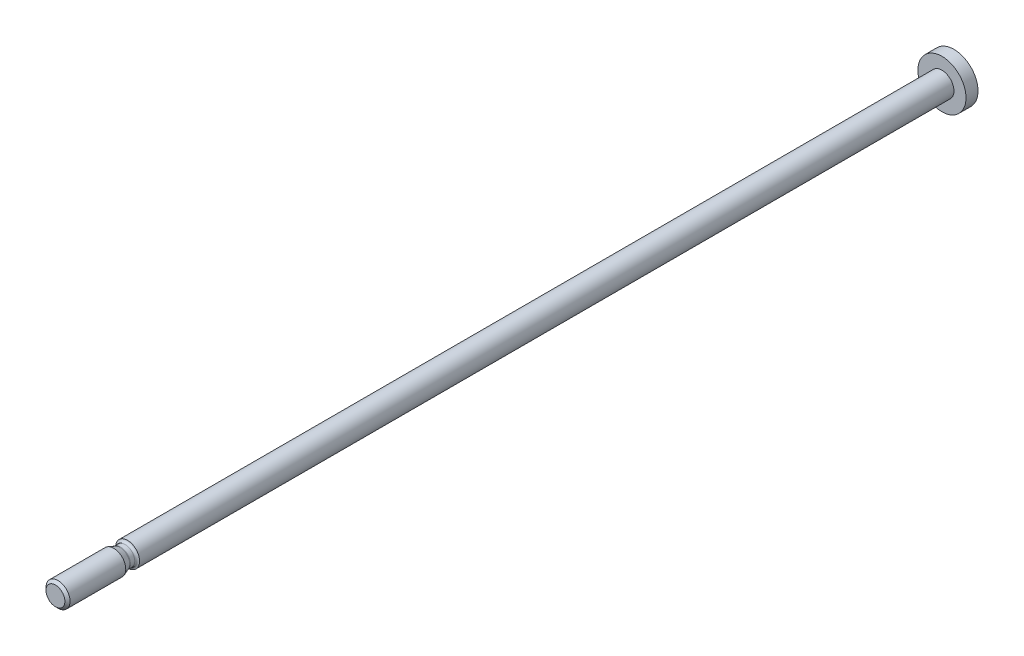
ISO-10303-21;
HEADER;
FILE_DESCRIPTION(('STEP AP214'),'2;1');
FILE_NAME('part.step','',(''),(''),'','','');
FILE_SCHEMA(('AUTOMOTIVE_DESIGN { 1 0 10303 214 1 1 1 1 }'));
ENDSEC;
DATA;
#1=APPLICATION_CONTEXT('core data for automotive mechanical design processes');
#2=APPLICATION_PROTOCOL_DEFINITION('international standard','automotive_design',2000,#1);
#3=PRODUCT_CONTEXT('',#1,'mechanical');
#4=PRODUCT('Part','Part','',(#3));
#5=PRODUCT_RELATED_PRODUCT_CATEGORY('part','',(#4));
#6=PRODUCT_DEFINITION_FORMATION('','',#4);
#7=PRODUCT_DEFINITION_CONTEXT('part definition',#1,'design');
#8=PRODUCT_DEFINITION('design','',#6,#7);
#9=PRODUCT_DEFINITION_SHAPE('','',#8);
#10=(LENGTH_UNIT() NAMED_UNIT(*) SI_UNIT(.MILLI.,.METRE.));
#11=(NAMED_UNIT(*) PLANE_ANGLE_UNIT() SI_UNIT($,.RADIAN.));
#12=(NAMED_UNIT(*) SI_UNIT($,.STERADIAN.) SOLID_ANGLE_UNIT());
#13=UNCERTAINTY_MEASURE_WITH_UNIT(LENGTH_MEASURE(1.E-05),#10,'distance_accuracy_value','');
#14=(GEOMETRIC_REPRESENTATION_CONTEXT(3) GLOBAL_UNCERTAINTY_ASSIGNED_CONTEXT((#13)) GLOBAL_UNIT_ASSIGNED_CONTEXT((#10,
#11,#12)) REPRESENTATION_CONTEXT('',''));
#15=CARTESIAN_POINT('',(0.,0.,0.));
#16=DIRECTION('',(0.,0.,1.));
#17=DIRECTION('',(1.,0.,0.));
#18=AXIS2_PLACEMENT_3D('',#15,#16,#17);
#19=CARTESIAN_POINT('',(0.,0.,-133.5));
#20=DIRECTION('',(0.,0.,1.));
#21=DIRECTION('',(1.,0.,0.));
#22=AXIS2_PLACEMENT_3D('',#19,#20,#21);
#23=CYLINDRICAL_SURFACE('',#22,2.);
#24=CARTESIAN_POINT('',(0.,0.,4.));
#25=DIRECTION('',(0.,0.,1.));
#26=DIRECTION('',(1.,0.,0.));
#27=AXIS2_PLACEMENT_3D('',#24,#25,#26);
#28=CIRCLE('',#27,2.);
#29=CARTESIAN_POINT('',(2.,0.,4.));
#30=VERTEX_POINT('',#29);
#31=EDGE_CURVE('E10',#30,#30,#28,.T.);
#32=ORIENTED_EDGE('',*,*,#31,.F.);
#33=EDGE_LOOP('',(#32));
#34=FACE_BOUND('',#33,.T.);
#35=CARTESIAN_POINT('',(0.,0.,-131.5));
#36=DIRECTION('',(0.,0.,1.));
#37=DIRECTION('',(1.,0.,0.));
#38=AXIS2_PLACEMENT_3D('',#35,#36,#37);
#39=CIRCLE('',#38,2.);
#40=CARTESIAN_POINT('',(2.,0.,-131.5));
#41=VERTEX_POINT('',#40);
#42=EDGE_CURVE('E43',#41,#41,#39,.T.);
#43=ORIENTED_EDGE('',*,*,#42,.T.);
#44=EDGE_LOOP('',(#43));
#45=FACE_BOUND('',#44,.T.);
#46=ADVANCED_FACE('F37',(#34,#45),#23,.T.);
#47=CARTESIAN_POINT('',(0.,2.,-131.5));
#48=DIRECTION('',(0.,0.,-1.));
#49=DIRECTION('',(-1.,0.,0.));
#50=AXIS2_PLACEMENT_3D('',#47,#48,#49);
#51=PLANE('',#50);
#52=ORIENTED_EDGE('',*,*,#42,.F.);
#53=EDGE_LOOP('',(#52));
#54=FACE_BOUND('',#53,.T.);
#55=CARTESIAN_POINT('',(0.,0.,-131.5));
#56=DIRECTION('',(0.,0.,1.));
#57=DIRECTION('',(1.,0.,0.));
#58=AXIS2_PLACEMENT_3D('',#55,#56,#57);
#59=CIRCLE('',#58,4.);
#60=CARTESIAN_POINT('',(4.,0.,-131.5));
#61=VERTEX_POINT('',#60);
#62=EDGE_CURVE('E47',#61,#61,#59,.T.);
#63=ORIENTED_EDGE('',*,*,#62,.T.);
#64=EDGE_LOOP('',(#63));
#65=FACE_BOUND('',#64,.T.);
#66=ADVANCED_FACE('F118',(#54,#65),#51,.F.);
#67=CARTESIAN_POINT('',(0.,0.,-133.5));
#68=DIRECTION('',(0.,0.,1.));
#69=DIRECTION('',(1.,0.,0.));
#70=AXIS2_PLACEMENT_3D('',#67,#68,#69);
#71=CYLINDRICAL_SURFACE('',#70,4.);
#72=ORIENTED_EDGE('',*,*,#62,.F.);
#73=EDGE_LOOP('',(#72));
#74=FACE_BOUND('',#73,.T.);
#75=CARTESIAN_POINT('',(0.,0.,-133.5));
#76=DIRECTION('',(0.,0.,1.));
#77=DIRECTION('',(1.,0.,0.));
#78=AXIS2_PLACEMENT_3D('',#75,#76,#77);
#79=CIRCLE('',#78,4.);
#80=CARTESIAN_POINT('',(4.,0.,-133.5));
#81=VERTEX_POINT('',#80);
#82=EDGE_CURVE('E51',#81,#81,#79,.T.);
#83=ORIENTED_EDGE('',*,*,#82,.T.);
#84=EDGE_LOOP('',(#83));
#85=FACE_BOUND('',#84,.T.);
#86=ADVANCED_FACE('F114',(#74,#85),#71,.T.);
#87=CARTESIAN_POINT('',(0.,4.,-133.5));
#88=DIRECTION('',(0.,0.,1.));
#89=DIRECTION('',(1.,0.,0.));
#90=AXIS2_PLACEMENT_3D('',#87,#88,#89);
#91=PLANE('',#90);
#92=ORIENTED_EDGE('',*,*,#82,.F.);
#93=EDGE_LOOP('',(#92));
#94=FACE_BOUND('',#93,.T.);
#95=ADVANCED_FACE('F109',(#94),#91,.F.);
#96=CARTESIAN_POINT('',(0.,0.,4.40000000000006));
#97=DIRECTION('',(0.,0.,1.));
#98=DIRECTION('',(1.,0.,0.));
#99=AXIS2_PLACEMENT_3D('',#96,#97,#98);
#100=TOROIDAL_SURFACE('',#99,2.00000000000006,0.400000000000064);
#101=CARTESIAN_POINT('',(0.,0.,4.4));
#102=DIRECTION('',(0.,0.,1.));
#103=DIRECTION('',(1.,0.,0.));
#104=AXIS2_PLACEMENT_3D('',#101,#102,#103);
#105=CIRCLE('',#104,1.6);
#106=CARTESIAN_POINT('',(1.6,0.,4.4));
#107=VERTEX_POINT('',#106);
#108=EDGE_CURVE('E56',#107,#107,#105,.T.);
#109=ORIENTED_EDGE('',*,*,#108,.F.);
#110=EDGE_LOOP('',(#109));
#111=FACE_BOUND('',#110,.T.);
#112=ORIENTED_EDGE('',*,*,#31,.T.);
#113=EDGE_LOOP('',(#112));
#114=FACE_BOUND('',#113,.T.);
#115=ADVANCED_FACE('F104',(#111,#114),#100,.F.);
#116=CARTESIAN_POINT('',(0.,0.,3.));
#117=DIRECTION('',(0.,0.,1.));
#118=DIRECTION('',(1.,0.,0.));
#119=AXIS2_PLACEMENT_3D('',#116,#117,#118);
#120=CYLINDRICAL_SURFACE('',#119,1.6);
#121=CARTESIAN_POINT('',(0.,0.,5.1294692077166));
#122=DIRECTION('',(0.,0.,1.));
#123=DIRECTION('',(1.,0.,0.));
#124=AXIS2_PLACEMENT_3D('',#121,#122,#123);
#125=CIRCLE('',#124,1.6);
#126=CARTESIAN_POINT('',(1.6,0.,5.1294692077166));
#127=VERTEX_POINT('',#126);
#128=EDGE_CURVE('E59',#127,#127,#125,.T.);
#129=ORIENTED_EDGE('',*,*,#128,.F.);
#130=EDGE_LOOP('',(#129));
#131=FACE_BOUND('',#130,.T.);
#132=ORIENTED_EDGE('',*,*,#108,.T.);
#133=EDGE_LOOP('',(#132));
#134=FACE_BOUND('',#133,.T.);
#135=ADVANCED_FACE('F98',(#131,#134),#120,.T.);
#136=CARTESIAN_POINT('',(0.,0.,5.12946920771671));
#137=DIRECTION('',(0.,0.,1.));
#138=DIRECTION('',(1.,0.,0.));
#139=AXIS2_PLACEMENT_3D('',#136,#137,#138);
#140=TOROIDAL_SURFACE('',#139,2.00000000000013,0.400000000000127);
#141=CARTESIAN_POINT('',(0.,0.,5.2662772650469));
#142=DIRECTION('',(0.,0.,1.));
#143=DIRECTION('',(1.,0.,0.));
#144=AXIS2_PLACEMENT_3D('',#141,#142,#143);
#145=CIRCLE('',#144,1.6241229516856);
#146=CARTESIAN_POINT('',(1.6241229516856,0.,5.2662772650469));
#147=VERTEX_POINT('',#146);
#148=EDGE_CURVE('E62',#147,#147,#145,.T.);
#149=ORIENTED_EDGE('',*,*,#148,.F.);
#150=EDGE_LOOP('',(#149));
#151=FACE_BOUND('',#150,.T.);
#152=ORIENTED_EDGE('',*,*,#128,.T.);
#153=EDGE_LOOP('',(#152));
#154=FACE_BOUND('',#153,.T.);
#155=ADVANCED_FACE('F92',(#151,#154),#140,.F.);
#156=CARTESIAN_POINT('',(0.,0.,5.2662772650469));
#157=DIRECTION('',(0.,0.,1.));
#158=DIRECTION('',(1.,0.,0.));
#159=AXIS2_PLACEMENT_3D('',#156,#157,#158);
#160=CONICAL_SURFACE('',#159,1.6241229516856,0.349065850398918);
#161=CARTESIAN_POINT('',(0.,0.,6.2989909677818));
#162=DIRECTION('',(0.,0.,1.));
#163=DIRECTION('',(1.,0.,0.));
#164=AXIS2_PLACEMENT_3D('',#161,#162,#163);
#165=CIRCLE('',#164,2.);
#166=CARTESIAN_POINT('',(2.,0.,6.2989909677818));
#167=VERTEX_POINT('',#166);
#168=EDGE_CURVE('E65',#167,#167,#165,.T.);
#169=ORIENTED_EDGE('',*,*,#168,.F.);
#170=EDGE_LOOP('',(#169));
#171=FACE_BOUND('',#170,.T.);
#172=ORIENTED_EDGE('',*,*,#148,.T.);
#173=EDGE_LOOP('',(#172));
#174=FACE_BOUND('',#173,.T.);
#175=ADVANCED_FACE('F86',(#171,#174),#160,.T.);
#176=CARTESIAN_POINT('',(0.,0.,3.));
#177=DIRECTION('',(0.,0.,1.));
#178=DIRECTION('',(1.,0.,0.));
#179=AXIS2_PLACEMENT_3D('',#176,#177,#178);
#180=CYLINDRICAL_SURFACE('',#179,2.);
#181=CARTESIAN_POINT('',(0.,0.,15.5705));
#182=DIRECTION('',(0.,0.,1.));
#183=DIRECTION('',(1.,0.,0.));
#184=AXIS2_PLACEMENT_3D('',#181,#182,#183);
#185=CIRCLE('',#184,2.);
#186=CARTESIAN_POINT('',(2.,0.,15.5705));
#187=VERTEX_POINT('',#186);
#188=EDGE_CURVE('E68',#187,#187,#185,.T.);
#189=ORIENTED_EDGE('',*,*,#188,.F.);
#190=EDGE_LOOP('',(#189));
#191=FACE_BOUND('',#190,.T.);
#192=ORIENTED_EDGE('',*,*,#168,.T.);
#193=EDGE_LOOP('',(#192));
#194=FACE_BOUND('',#193,.T.);
#195=ADVANCED_FACE('F80',(#191,#194),#180,.T.);
#196=CARTESIAN_POINT('',(0.,0.,15.5705));
#197=DIRECTION('',(0.,0.,-1.));
#198=DIRECTION('',(-1.,0.,0.));
#199=AXIS2_PLACEMENT_3D('',#196,#197,#198);
#200=CONICAL_SURFACE('',#199,2.,0.785398163397445);
#201=CARTESIAN_POINT('',(0.,0.,16.));
#202=DIRECTION('',(0.,0.,1.));
#203=DIRECTION('',(1.,0.,0.));
#204=AXIS2_PLACEMENT_3D('',#201,#202,#203);
#205=CIRCLE('',#204,1.5705);
#206=CARTESIAN_POINT('',(1.5705,0.,16.));
#207=VERTEX_POINT('',#206);
#208=EDGE_CURVE('E71',#207,#207,#205,.T.);
#209=ORIENTED_EDGE('',*,*,#208,.F.);
#210=EDGE_LOOP('',(#209));
#211=FACE_BOUND('',#210,.T.);
#212=ORIENTED_EDGE('',*,*,#188,.T.);
#213=EDGE_LOOP('',(#212));
#214=FACE_BOUND('',#213,.T.);
#215=ADVANCED_FACE('F77',(#211,#214),#200,.T.);
#216=CARTESIAN_POINT('',(0.,0.,16.));
#217=DIRECTION('',(0.,0.,-1.));
#218=DIRECTION('',(-1.,0.,0.));
#219=AXIS2_PLACEMENT_3D('',#216,#217,#218);
#220=PLANE('',#219);
#221=ORIENTED_EDGE('',*,*,#208,.T.);
#222=EDGE_LOOP('',(#221));
#223=FACE_BOUND('',#222,.T.);
#224=ADVANCED_FACE('F75',(#223),#220,.F.);
#225=CLOSED_SHELL('',(#46,#66,#86,#95,#115,#135,#155,#175,#195,#215,#224));
#226=MANIFOLD_SOLID_BREP('B2',#225);
#227=ADVANCED_BREP_SHAPE_REPRESENTATION('',(#18,#226),#14);
#228=SHAPE_DEFINITION_REPRESENTATION(#9,#227);
ENDSEC;
END-ISO-10303-21;
